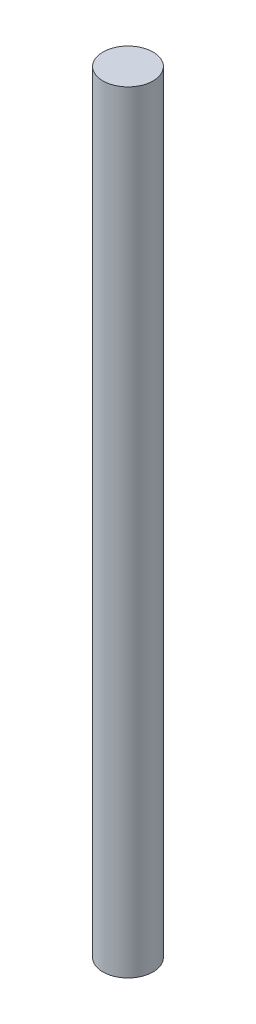
ISO-10303-21;
HEADER;
FILE_DESCRIPTION(('STEP AP214'),'2;1');
FILE_NAME('part.step','',(''),(''),'','','');
FILE_SCHEMA(('AUTOMOTIVE_DESIGN { 1 0 10303 214 1 1 1 1 }'));
ENDSEC;
DATA;
#1=APPLICATION_CONTEXT('core data for automotive mechanical design processes');
#2=APPLICATION_PROTOCOL_DEFINITION('international standard','automotive_design',2000,#1);
#3=PRODUCT_CONTEXT('',#1,'mechanical');
#4=PRODUCT('Part','Part','',(#3));
#5=PRODUCT_RELATED_PRODUCT_CATEGORY('part','',(#4));
#6=PRODUCT_DEFINITION_FORMATION('','',#4);
#7=PRODUCT_DEFINITION_CONTEXT('part definition',#1,'design');
#8=PRODUCT_DEFINITION('design','',#6,#7);
#9=PRODUCT_DEFINITION_SHAPE('','',#8);
#10=(LENGTH_UNIT() NAMED_UNIT(*) SI_UNIT(.MILLI.,.METRE.));
#11=(NAMED_UNIT(*) PLANE_ANGLE_UNIT() SI_UNIT($,.RADIAN.));
#12=(NAMED_UNIT(*) SI_UNIT($,.STERADIAN.) SOLID_ANGLE_UNIT());
#13=UNCERTAINTY_MEASURE_WITH_UNIT(LENGTH_MEASURE(1.E-05),#10,'distance_accuracy_value','');
#14=(GEOMETRIC_REPRESENTATION_CONTEXT(3) GLOBAL_UNCERTAINTY_ASSIGNED_CONTEXT((#13)) GLOBAL_UNIT_ASSIGNED_CONTEXT((#10,
#11,#12)) REPRESENTATION_CONTEXT('',''));
#15=CARTESIAN_POINT('',(0.,0.,0.));
#16=DIRECTION('',(0.,0.,1.));
#17=DIRECTION('',(1.,0.,0.));
#18=AXIS2_PLACEMENT_3D('',#15,#16,#17);
#19=CARTESIAN_POINT('',(0.,15.4,0.));
#20=DIRECTION('',(0.,1.,0.));
#21=DIRECTION('',(0.,0.,1.));
#22=AXIS2_PLACEMENT_3D('',#19,#20,#21);
#23=PLANE('',#22);
#24=CARTESIAN_POINT('',(0.,15.4,0.));
#25=DIRECTION('',(0.,1.,0.));
#26=DIRECTION('',(0.,0.,1.));
#27=AXIS2_PLACEMENT_3D('',#24,#25,#26);
#28=CIRCLE('',#27,0.5);
#29=CARTESIAN_POINT('',(0.,15.4,0.5));
#30=VERTEX_POINT('',#29);
#31=EDGE_CURVE('E16',#30,#30,#28,.F.);
#32=ORIENTED_EDGE('',*,*,#31,.F.);
#33=EDGE_LOOP('',(#32));
#34=FACE_BOUND('',#33,.T.);
#35=ADVANCED_FACE('F13',(#34),#23,.T.);
#36=CARTESIAN_POINT('',(0.,0.,0.));
#37=DIRECTION('',(0.,1.,0.));
#38=DIRECTION('',(0.,0.,1.));
#39=AXIS2_PLACEMENT_3D('',#36,#37,#38);
#40=PLANE('',#39);
#41=CARTESIAN_POINT('',(0.,0.,0.));
#42=DIRECTION('',(0.,1.,0.));
#43=DIRECTION('',(0.,0.,1.));
#44=AXIS2_PLACEMENT_3D('',#41,#42,#43);
#45=CIRCLE('',#44,0.5);
#46=CARTESIAN_POINT('',(0.,0.,0.5));
#47=VERTEX_POINT('',#46);
#48=EDGE_CURVE('E9',#47,#47,#45,.T.);
#49=ORIENTED_EDGE('',*,*,#48,.F.);
#50=EDGE_LOOP('',(#49));
#51=FACE_BOUND('',#50,.T.);
#52=ADVANCED_FACE('F28',(#51),#40,.F.);
#53=CARTESIAN_POINT('',(0.,0.,0.));
#54=DIRECTION('',(0.,1.,0.));
#55=DIRECTION('',(0.,0.,1.));
#56=AXIS2_PLACEMENT_3D('',#53,#54,#55);
#57=CYLINDRICAL_SURFACE('',#56,0.5);
#58=ORIENTED_EDGE('',*,*,#48,.T.);
#59=EDGE_LOOP('',(#58));
#60=FACE_BOUND('',#59,.T.);
#61=ORIENTED_EDGE('',*,*,#31,.T.);
#62=EDGE_LOOP('',(#61));
#63=FACE_BOUND('',#62,.T.);
#64=ADVANCED_FACE('F25',(#60,#63),#57,.T.);
#65=CLOSED_SHELL('',(#35,#52,#64));
#66=MANIFOLD_SOLID_BREP('B1',#65);
#67=ADVANCED_BREP_SHAPE_REPRESENTATION('',(#18,#66),#14);
#68=SHAPE_DEFINITION_REPRESENTATION(#9,#67);
ENDSEC;
END-ISO-10303-21;
